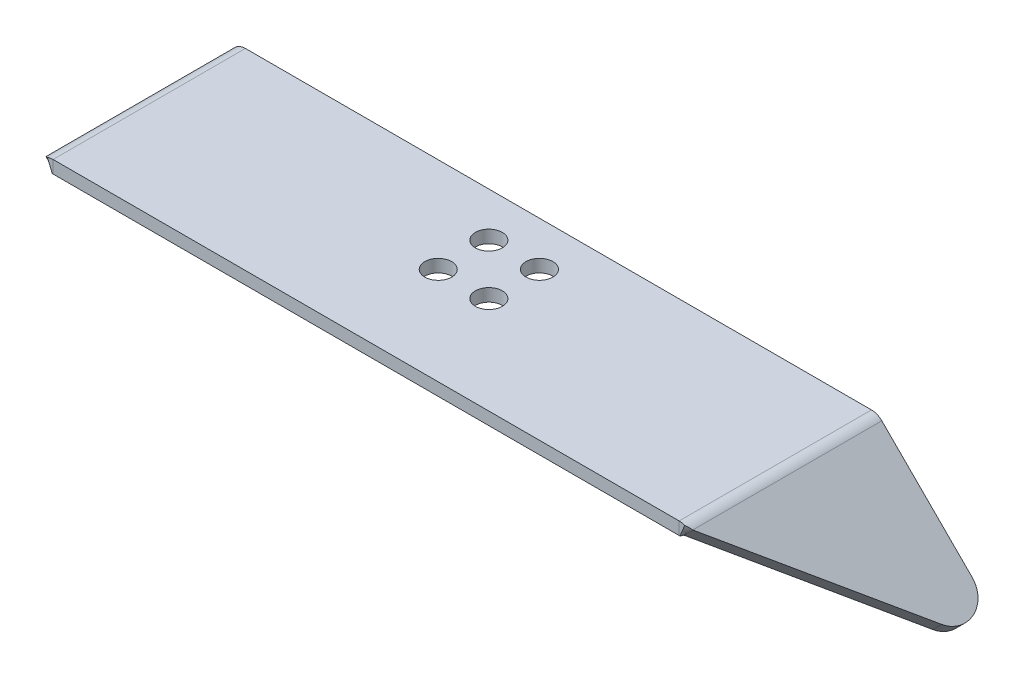
ISO-10303-21;
HEADER;
FILE_DESCRIPTION(('STEP AP214'),'2;1');
FILE_NAME('part.step','',(''),(''),'','','');
FILE_SCHEMA(('AUTOMOTIVE_DESIGN { 1 0 10303 214 1 1 1 1 }'));
ENDSEC;
DATA;
#1=APPLICATION_CONTEXT('core data for automotive mechanical design processes');
#2=APPLICATION_PROTOCOL_DEFINITION('international standard','automotive_design',2000,#1);
#3=PRODUCT_CONTEXT('',#1,'mechanical');
#4=PRODUCT('Part','Part','',(#3));
#5=PRODUCT_RELATED_PRODUCT_CATEGORY('part','',(#4));
#6=PRODUCT_DEFINITION_FORMATION('','',#4);
#7=PRODUCT_DEFINITION_CONTEXT('part definition',#1,'design');
#8=PRODUCT_DEFINITION('design','',#6,#7);
#9=PRODUCT_DEFINITION_SHAPE('','',#8);
#10=(LENGTH_UNIT() NAMED_UNIT(*) SI_UNIT(.MILLI.,.METRE.));
#11=(NAMED_UNIT(*) PLANE_ANGLE_UNIT() SI_UNIT($,.RADIAN.));
#12=(NAMED_UNIT(*) SI_UNIT($,.STERADIAN.) SOLID_ANGLE_UNIT());
#13=UNCERTAINTY_MEASURE_WITH_UNIT(LENGTH_MEASURE(1.E-05),#10,'distance_accuracy_value','');
#14=(GEOMETRIC_REPRESENTATION_CONTEXT(3) GLOBAL_UNCERTAINTY_ASSIGNED_CONTEXT((#13)) GLOBAL_UNIT_ASSIGNED_CONTEXT((#10,
#11,#12)) REPRESENTATION_CONTEXT('',''));
#15=CARTESIAN_POINT('',(0.,0.,0.));
#16=DIRECTION('',(0.,0.,1.));
#17=DIRECTION('',(1.,0.,0.));
#18=AXIS2_PLACEMENT_3D('',#15,#16,#17);
#19=CARTESIAN_POINT('',(-112.304743878931,3.175,6.35));
#20=DIRECTION('',(0.,-1.,0.));
#21=DIRECTION('',(0.,0.,-1.));
#22=AXIS2_PLACEMENT_3D('',#19,#20,#21);
#23=PLANE('',#22);
#24=CARTESIAN_POINT('',(-6.35,3.175,11.1125));
#25=DIRECTION('',(0.,1.,0.));
#26=DIRECTION('',(0.,0.,1.));
#27=AXIS2_PLACEMENT_3D('',#24,#25,#26);
#28=CIRCLE('',#27,3.3782);
#29=CARTESIAN_POINT('',(-6.35,3.175,14.4907));
#30=VERTEX_POINT('',#29);
#31=EDGE_CURVE('E593',#30,#30,#28,.T.);
#32=ORIENTED_EDGE('',*,*,#31,.F.);
#33=EDGE_LOOP('',(#32));
#34=FACE_BOUND('',#33,.T.);
#35=CARTESIAN_POINT('',(6.35,3.175,11.1125));
#36=DIRECTION('',(0.,1.,0.));
#37=DIRECTION('',(0.,0.,1.));
#38=AXIS2_PLACEMENT_3D('',#35,#36,#37);
#39=CIRCLE('',#38,3.3782);
#40=CARTESIAN_POINT('',(6.35,3.175,14.4907));
#41=VERTEX_POINT('',#40);
#42=EDGE_CURVE('E587',#41,#41,#39,.T.);
#43=ORIENTED_EDGE('',*,*,#42,.F.);
#44=EDGE_LOOP('',(#43));
#45=FACE_BOUND('',#44,.T.);
#46=CARTESIAN_POINT('',(-6.35,3.175,23.8125));
#47=DIRECTION('',(0.,1.,0.));
#48=DIRECTION('',(0.,0.,1.));
#49=AXIS2_PLACEMENT_3D('',#46,#47,#48);
#50=CIRCLE('',#49,3.3782);
#51=CARTESIAN_POINT('',(-6.35,3.175,27.1907));
#52=VERTEX_POINT('',#51);
#53=EDGE_CURVE('E571',#52,#52,#50,.T.);
#54=ORIENTED_EDGE('',*,*,#53,.F.);
#55=EDGE_LOOP('',(#54));
#56=FACE_BOUND('',#55,.T.);
#57=DIRECTION('',(0.,0.,1.));
#58=VECTOR('',#57,1.);
#59=CARTESIAN_POINT('',(78.5552406669539,3.175,6.35));
#60=LINE('',#59,#58);
#61=CARTESIAN_POINT('',(78.5552406669539,3.175,0.));
#62=VERTEX_POINT('',#61);
#63=CARTESIAN_POINT('',(78.5552406669539,3.175,48.26));
#64=VERTEX_POINT('',#63);
#65=EDGE_CURVE('E333',#62,#64,#60,.T.);
#66=ORIENTED_EDGE('',*,*,#65,.F.);
#67=DIRECTION('',(-1.,0.,0.));
#68=VECTOR('',#67,1.);
#69=CARTESIAN_POINT('',(112.304743878931,3.175,0.));
#70=LINE('',#69,#68);
#71=CARTESIAN_POINT('',(-78.5552406669539,3.175,0.));
#72=VERTEX_POINT('',#71);
#73=EDGE_CURVE('E350',#62,#72,#70,.T.);
#74=ORIENTED_EDGE('',*,*,#73,.T.);
#75=DIRECTION('',(0.,0.,1.));
#76=VECTOR('',#75,1.);
#77=CARTESIAN_POINT('',(-78.5552406669539,3.175,6.35));
#78=LINE('',#77,#76);
#79=CARTESIAN_POINT('',(-78.5552406669538,3.175,48.26));
#80=VERTEX_POINT('',#79);
#81=EDGE_CURVE('E354',#72,#80,#78,.T.);
#82=ORIENTED_EDGE('',*,*,#81,.T.);
#83=DIRECTION('',(1.,0.,0.));
#84=VECTOR('',#83,1.);
#85=CARTESIAN_POINT('',(79.375,3.175,48.26));
#86=LINE('',#85,#84);
#87=EDGE_CURVE('E348',#80,#64,#86,.T.);
#88=ORIENTED_EDGE('',*,*,#87,.T.);
#89=EDGE_LOOP('',(#66,#74,#82,#88));
#90=FACE_BOUND('',#89,.T.);
#91=CARTESIAN_POINT('',(6.35,3.175,23.8125));
#92=DIRECTION('',(0.,1.,0.));
#93=DIRECTION('',(0.,0.,1.));
#94=AXIS2_PLACEMENT_3D('',#91,#92,#93);
#95=CIRCLE('',#94,3.3782);
#96=CARTESIAN_POINT('',(6.35,3.175,27.1907));
#97=VERTEX_POINT('',#96);
#98=EDGE_CURVE('E579',#97,#97,#95,.T.);
#99=ORIENTED_EDGE('',*,*,#98,.F.);
#100=EDGE_LOOP('',(#99));
#101=FACE_BOUND('',#100,.T.);
#102=ADVANCED_FACE('F61',(#34,#45,#56,#90,#101),#23,.F.);
#103=CARTESIAN_POINT('',(-112.304743878931,0.,6.35));
#104=DIRECTION('',(0.,-1.,0.));
#105=DIRECTION('',(0.,0.,-1.));
#106=AXIS2_PLACEMENT_3D('',#103,#104,#105);
#107=PLANE('',#106);
#108=CARTESIAN_POINT('',(-6.35,0.,11.1125));
#109=DIRECTION('',(0.,-1.,0.));
#110=DIRECTION('',(0.,0.,-1.));
#111=AXIS2_PLACEMENT_3D('',#108,#109,#110);
#112=CIRCLE('',#111,3.3782);
#113=CARTESIAN_POINT('',(-6.35,0.,7.7343));
#114=VERTEX_POINT('',#113);
#115=EDGE_CURVE('E590',#114,#114,#112,.T.);
#116=ORIENTED_EDGE('',*,*,#115,.F.);
#117=EDGE_LOOP('',(#116));
#118=FACE_BOUND('',#117,.T.);
#119=CARTESIAN_POINT('',(6.35,0.,11.1125));
#120=DIRECTION('',(0.,-1.,0.));
#121=DIRECTION('',(0.,0.,-1.));
#122=AXIS2_PLACEMENT_3D('',#119,#120,#121);
#123=CIRCLE('',#122,3.3782);
#124=CARTESIAN_POINT('',(6.35,0.,7.7343));
#125=VERTEX_POINT('',#124);
#126=EDGE_CURVE('E584',#125,#125,#123,.T.);
#127=ORIENTED_EDGE('',*,*,#126,.F.);
#128=EDGE_LOOP('',(#127));
#129=FACE_BOUND('',#128,.T.);
#130=CARTESIAN_POINT('',(6.35,0.,23.8125));
#131=DIRECTION('',(0.,-1.,0.));
#132=DIRECTION('',(0.,0.,-1.));
#133=AXIS2_PLACEMENT_3D('',#130,#131,#132);
#134=CIRCLE('',#133,3.3782);
#135=CARTESIAN_POINT('',(6.35,0.,20.4343));
#136=VERTEX_POINT('',#135);
#137=EDGE_CURVE('E575',#136,#136,#134,.T.);
#138=ORIENTED_EDGE('',*,*,#137,.F.);
#139=EDGE_LOOP('',(#138));
#140=FACE_BOUND('',#139,.T.);
#141=CARTESIAN_POINT('',(-6.35,0.,23.8125));
#142=DIRECTION('',(0.,-1.,0.));
#143=DIRECTION('',(0.,0.,-1.));
#144=AXIS2_PLACEMENT_3D('',#141,#142,#143);
#145=CIRCLE('',#144,3.3782);
#146=CARTESIAN_POINT('',(-6.35,0.,20.4343));
#147=VERTEX_POINT('',#146);
#148=EDGE_CURVE('E199',#147,#147,#145,.T.);
#149=ORIENTED_EDGE('',*,*,#148,.F.);
#150=EDGE_LOOP('',(#149));
#151=FACE_BOUND('',#150,.T.);
#152=DIRECTION('',(-1.,0.,0.));
#153=VECTOR('',#152,1.);
#154=CARTESIAN_POINT('',(-112.304743878931,0.,0.));
#155=LINE('',#154,#153);
#156=CARTESIAN_POINT('',(78.5552406669539,0.,0.));
#157=VERTEX_POINT('',#156);
#158=CARTESIAN_POINT('',(-78.5552406669539,0.,0.));
#159=VERTEX_POINT('',#158);
#160=EDGE_CURVE('E78',#157,#159,#155,.T.);
#161=ORIENTED_EDGE('',*,*,#160,.F.);
#162=DIRECTION('',(0.,0.,1.));
#163=VECTOR('',#162,1.);
#164=CARTESIAN_POINT('',(78.5552406669539,0.,6.35));
#165=LINE('',#164,#163);
#166=CARTESIAN_POINT('',(78.5552406669539,0.,48.26));
#167=VERTEX_POINT('',#166);
#168=EDGE_CURVE('E70',#157,#167,#165,.T.);
#169=ORIENTED_EDGE('',*,*,#168,.T.);
#170=DIRECTION('',(1.,0.,0.));
#171=VECTOR('',#170,1.);
#172=CARTESIAN_POINT('',(79.375,0.,48.26));
#173=LINE('',#172,#171);
#174=CARTESIAN_POINT('',(-78.5552406669538,0.,48.26));
#175=VERTEX_POINT('',#174);
#176=EDGE_CURVE('E86',#175,#167,#173,.T.);
#177=ORIENTED_EDGE('',*,*,#176,.F.);
#178=DIRECTION('',(0.,0.,1.));
#179=VECTOR('',#178,1.);
#180=CARTESIAN_POINT('',(-78.5552406669539,0.,6.35));
#181=LINE('',#180,#179);
#182=EDGE_CURVE('E471',#159,#175,#181,.T.);
#183=ORIENTED_EDGE('',*,*,#182,.F.);
#184=EDGE_LOOP('',(#161,#169,#177,#183));
#185=FACE_BOUND('',#184,.T.);
#186=ADVANCED_FACE('F387',(#118,#129,#140,#151,#185),#107,.T.);
#187=CARTESIAN_POINT('',(-112.304743878931,3.175,0.));
#188=DIRECTION('',(0.,0.,1.));
#189=DIRECTION('',(1.,0.,0.));
#190=AXIS2_PLACEMENT_3D('',#187,#188,#189);
#191=PLANE('',#190);
#192=DIRECTION('',(0.,1.,0.));
#193=VECTOR('',#192,1.);
#194=CARTESIAN_POINT('',(78.5552406669539,3.175,0.));
#195=LINE('',#194,#193);
#196=EDGE_CURVE('E12',#157,#62,#195,.T.);
#197=ORIENTED_EDGE('',*,*,#196,.F.);
#198=ORIENTED_EDGE('',*,*,#160,.T.);
#199=DIRECTION('',(0.,1.,0.));
#200=VECTOR('',#199,1.);
#201=CARTESIAN_POINT('',(-78.5552406669539,3.175,0.));
#202=LINE('',#201,#200);
#203=EDGE_CURVE('E468',#159,#72,#202,.T.);
#204=ORIENTED_EDGE('',*,*,#203,.T.);
#205=ORIENTED_EDGE('',*,*,#73,.F.);
#206=EDGE_LOOP('',(#197,#198,#204,#205));
#207=FACE_BOUND('',#206,.T.);
#208=ADVANCED_FACE('F63',(#207),#191,.F.);
#209=CARTESIAN_POINT('',(79.375,3.175,48.26));
#210=DIRECTION('',(0.,0.,-1.));
#211=DIRECTION('',(-1.,0.,0.));
#212=AXIS2_PLACEMENT_3D('',#209,#210,#211);
#213=PLANE('',#212);
#214=DIRECTION('',(0.,-1.,0.));
#215=VECTOR('',#214,1.);
#216=CARTESIAN_POINT('',(78.5552406669539,3.175,48.26));
#217=LINE('',#216,#215);
#218=EDGE_CURVE('E341',#64,#167,#217,.T.);
#219=ORIENTED_EDGE('',*,*,#218,.F.);
#220=ORIENTED_EDGE('',*,*,#87,.F.);
#221=DIRECTION('',(0.,-1.,0.));
#222=VECTOR('',#221,1.);
#223=CARTESIAN_POINT('',(-78.5552406669539,3.175,48.26));
#224=LINE('',#223,#222);
#225=EDGE_CURVE('E342',#80,#175,#224,.T.);
#226=ORIENTED_EDGE('',*,*,#225,.T.);
#227=ORIENTED_EDGE('',*,*,#176,.T.);
#228=EDGE_LOOP('',(#219,#220,#226,#227));
#229=FACE_BOUND('',#228,.T.);
#230=ADVANCED_FACE('F397',(#229),#213,.F.);
#231=CARTESIAN_POINT('',(-78.5552406669539,-0.5,0.));
#232=DIRECTION('',(0.,0.,-1.));
#233=DIRECTION('',(-1.,0.,0.));
#234=AXIS2_PLACEMENT_3D('',#231,#232,#233);
#235=PLANE('',#234);
#236=ORIENTED_EDGE('',*,*,#203,.F.);
#237=CARTESIAN_POINT('',(-78.5552406669539,-0.5,0.));
#238=DIRECTION('',(0.,0.,1.));
#239=DIRECTION('',(1.,0.,0.));
#240=AXIS2_PLACEMENT_3D('',#237,#238,#239);
#241=CIRCLE('',#240,0.5);
#242=CARTESIAN_POINT('',(-78.9087940575472,-0.146446609406728,0.));
#243=VERTEX_POINT('',#242);
#244=EDGE_CURVE('E488',#159,#243,#241,.T.);
#245=ORIENTED_EDGE('',*,*,#244,.T.);
#246=DIRECTION('',(-0.707106781186549,0.707106781186546,0.));
#247=VECTOR('',#246,1.);
#248=CARTESIAN_POINT('',(-81.1538580878145,2.09861742086056,0.));
#249=LINE('',#248,#247);
#250=CARTESIAN_POINT('',(-81.1538580878145,2.09861742086057,0.));
#251=VERTEX_POINT('',#250);
#252=EDGE_CURVE('E512',#243,#251,#249,.T.);
#253=ORIENTED_EDGE('',*,*,#252,.T.);
#254=CARTESIAN_POINT('',(-78.5552406669539,-0.5,0.));
#255=DIRECTION('',(0.,0.,1.));
#256=DIRECTION('',(1.,0.,0.));
#257=AXIS2_PLACEMENT_3D('',#254,#255,#256);
#258=CIRCLE('',#257,3.675);
#259=EDGE_CURVE('E515',#72,#251,#258,.T.);
#260=ORIENTED_EDGE('',*,*,#259,.F.);
#261=EDGE_LOOP('',(#236,#245,#253,#260));
#262=FACE_BOUND('',#261,.T.);
#263=ADVANCED_FACE('F400',(#262),#235,.T.);
#264=CARTESIAN_POINT('',(-81.1538580878145,2.0986174208605,47.4402406669539));
#265=CARTESIAN_POINT('',(-80.813541159747,2.43893434892808,47.7136212660518));
#266=CARTESIAN_POINT('',(-80.4062477754293,2.71107908769504,47.9866194009021));
#267=CARTESIAN_POINT('',(-79.9616022808957,2.89525728197895,48.26));
#268=CARTESIAN_POINT('',(-78.9087940575472,-0.146446609406734,47.4402406669539));
#269=CARTESIAN_POINT('',(-78.862512230733,-0.10016478259256,47.7135043833971));
#270=CARTESIAN_POINT('',(-78.8070525039987,-0.0631077779238326,47.9867362835569));
#271=CARTESIAN_POINT('',(-78.7465823831365,-0.0380602337443602,48.26));
#272=B_SPLINE_SURFACE_WITH_KNOTS('',1,3,((#264,#265,#266,#267),(#268,#269,#270,#271)),
.UNSPECIFIED.,.F.,.F.,.F.,(2,2),(4,4),(0.,1.),(0.,1.),.UNSPECIFIED.);
#273=CARTESIAN_POINT('',(-81.1538580878145,2.0986174208605,47.4402406669539));
#274=CARTESIAN_POINT('',(-78.9087940575472,-0.146446609406734,47.4402406669539));
#275=B_SPLINE_CURVE_WITH_KNOTS('',1,(#273,#274),.UNSPECIFIED.,.F.,.F.,(2,2),(0.,1.),.UNSPECIFIED.);
#276=CARTESIAN_POINT('',(-81.1538580878145,2.0986174208605,47.4402406669539));
#277=VERTEX_POINT('',#276);
#278=CARTESIAN_POINT('',(-78.9087940575472,-0.146446609406728,47.4402406669539));
#279=VERTEX_POINT('',#278);
#280=EDGE_CURVE('E456',#277,#279,#275,.T.);
#281=CARTESIAN_POINT('',(-78.9087940575472,-0.146446609406734,47.4402406669539));
#282=CARTESIAN_POINT('',(-78.862512230733,-0.10016478259256,47.7135043833971));
#283=CARTESIAN_POINT('',(-78.8070525039987,-0.0631077779238326,47.9867362835569));
#284=CARTESIAN_POINT('',(-78.7465823831365,-0.0380602337443602,48.26));
#285=B_SPLINE_CURVE_WITH_KNOTS('',3,(#281,#282,#283,#284),.UNSPECIFIED.,.F.,.F.,(4,4),(0.,1.),.UNSPECIFIED.);
#286=CARTESIAN_POINT('',(-78.7465823831365,-0.0380602337443602,48.26));
#287=VERTEX_POINT('',#286);
#288=EDGE_CURVE('E522',#279,#287,#285,.T.);
#289=CARTESIAN_POINT('',(-78.7465823831365,-0.0380602337443602,48.26));
#290=CARTESIAN_POINT('',(-79.9616022808957,2.89525728197895,48.26));
#291=B_SPLINE_CURVE_WITH_KNOTS('',1,(#289,#290),.UNSPECIFIED.,.F.,.F.,(2,2),(0.,1.),.UNSPECIFIED.);
#292=CARTESIAN_POINT('',(-79.9616022808957,2.89525728197895,48.26));
#293=VERTEX_POINT('',#292);
#294=EDGE_CURVE('E347',#287,#293,#291,.T.);
#295=CARTESIAN_POINT('',(-79.9616022808957,2.89525728197895,48.26));
#296=CARTESIAN_POINT('',(-80.4062477754293,2.71107908769504,47.9866194009021));
#297=CARTESIAN_POINT('',(-80.813541159747,2.43893434892808,47.7136212660518));
#298=CARTESIAN_POINT('',(-81.1538580878145,2.0986174208605,47.4402406669539));
#299=B_SPLINE_CURVE_WITH_KNOTS('',3,(#295,#296,#297,#298),.UNSPECIFIED.,.F.,.F.,(4,4),(0.,1.),.UNSPECIFIED.);
#300=EDGE_CURVE('E518',#277,#293,#299,.F.);
#301=ORIENTED_EDGE('',*,*,#280,.T.);
#302=ORIENTED_EDGE('',*,*,#288,.T.);
#303=ORIENTED_EDGE('',*,*,#294,.T.);
#304=ORIENTED_EDGE('',*,*,#300,.F.);
#305=EDGE_LOOP('',(#301,#302,#303,#304));
#306=FACE_BOUND('',#305,.T.);
#307=ADVANCED_FACE('F403',(#306),#272,.T.);
#308=CARTESIAN_POINT('',(-78.5552406669539,-0.5,48.26));
#309=DIRECTION('',(0.,0.,1.));
#310=DIRECTION('',(1.,0.,0.));
#311=AXIS2_PLACEMENT_3D('',#308,#309,#310);
#312=PLANE('',#311);
#313=ORIENTED_EDGE('',*,*,#294,.F.);
#314=CARTESIAN_POINT('',(-78.5552406669539,-0.5,48.26));
#315=DIRECTION('',(0.,0.,1.));
#316=DIRECTION('',(1.,0.,0.));
#317=AXIS2_PLACEMENT_3D('',#314,#315,#316);
#318=CIRCLE('',#317,0.5);
#319=EDGE_CURVE('E519',#287,#175,#318,.F.);
#320=ORIENTED_EDGE('',*,*,#319,.T.);
#321=ORIENTED_EDGE('',*,*,#225,.F.);
#322=CARTESIAN_POINT('',(-78.5552406669539,-0.5,48.26));
#323=DIRECTION('',(0.,0.,-1.));
#324=DIRECTION('',(-1.,0.,0.));
#325=AXIS2_PLACEMENT_3D('',#322,#323,#324);
#326=CIRCLE('',#325,3.675);
#327=EDGE_CURVE('E529',#293,#80,#326,.T.);
#328=ORIENTED_EDGE('',*,*,#327,.F.);
#329=EDGE_LOOP('',(#313,#320,#321,#328));
#330=FACE_BOUND('',#329,.T.);
#331=ADVANCED_FACE('F410',(#330),#312,.T.);
#332=CARTESIAN_POINT('',(-78.5552406669539,-0.5,-24.2621093408467));
#333=DIRECTION('',(0.,0.,1.));
#334=DIRECTION('',(1.,0.,0.));
#335=AXIS2_PLACEMENT_3D('',#332,#333,#334);
#336=CYLINDRICAL_SURFACE('',#335,3.675);
#337=ORIENTED_EDGE('',*,*,#327,.T.);
#338=ORIENTED_EDGE('',*,*,#81,.F.);
#339=ORIENTED_EDGE('',*,*,#259,.T.);
#340=DIRECTION('',(0.,0.,1.));
#341=VECTOR('',#340,1.);
#342=CARTESIAN_POINT('',(-81.1538580878145,2.09861742086056,6.35));
#343=LINE('',#342,#341);
#344=EDGE_CURVE('E481',#251,#277,#343,.T.);
#345=ORIENTED_EDGE('',*,*,#344,.T.);
#346=ORIENTED_EDGE('',*,*,#300,.T.);
#347=EDGE_LOOP('',(#337,#338,#339,#345,#346));
#348=FACE_BOUND('',#347,.T.);
#349=ADVANCED_FACE('F324',(#348),#336,.T.);
#350=CARTESIAN_POINT('',(-78.5552406669539,-0.5,-24.2621093408467));
#351=DIRECTION('',(0.,0.,1.));
#352=DIRECTION('',(1.,0.,0.));
#353=AXIS2_PLACEMENT_3D('',#350,#351,#352);
#354=CYLINDRICAL_SURFACE('',#353,0.5);
#355=ORIENTED_EDGE('',*,*,#319,.F.);
#356=ORIENTED_EDGE('',*,*,#288,.F.);
#357=DIRECTION('',(0.,0.,1.));
#358=VECTOR('',#357,1.);
#359=CARTESIAN_POINT('',(-78.9087940575472,-0.146446609406728,6.35));
#360=LINE('',#359,#358);
#361=EDGE_CURVE('E492',#243,#279,#360,.T.);
#362=ORIENTED_EDGE('',*,*,#361,.F.);
#363=ORIENTED_EDGE('',*,*,#244,.F.);
#364=ORIENTED_EDGE('',*,*,#182,.T.);
#365=EDGE_LOOP('',(#355,#356,#362,#363,#364));
#366=FACE_BOUND('',#365,.T.);
#367=ADVANCED_FACE('F307',(#366),#354,.F.);
#368=CARTESIAN_POINT('',(-103.859045904005,-20.6065703953298,6.35));
#369=DIRECTION('',(0.707106781186549,-0.707106781186546,0.));
#370=DIRECTION('',(0.,0.,-1.));
#371=AXIS2_PLACEMENT_3D('',#368,#369,#370);
#372=CYLINDRICAL_SURFACE('',#371,6.35);
#373=CARTESIAN_POINT('',(-101.613981873737,-22.851634425597,6.35));
#374=DIRECTION('',(-0.707106781186549,0.707106781186546,0.));
#375=DIRECTION('',(0.,0.,-1.));
#376=AXIS2_PLACEMENT_3D('',#373,#374,#375);
#377=CIRCLE('',#376,6.35);
#378=CARTESIAN_POINT('',(-101.613981873737,-22.8516344255969,0.));
#379=VERTEX_POINT('',#378);
#380=CARTESIAN_POINT('',(-104.788981873737,-26.026634425597,10.8401280605347));
#381=VERTEX_POINT('',#380);
#382=EDGE_CURVE('E510',#379,#381,#377,.T.);
#383=ORIENTED_EDGE('',*,*,#382,.T.);
#384=DIRECTION('',(0.707106781186549,-0.707106781186546,0.));
#385=VECTOR('',#384,1.);
#386=CARTESIAN_POINT('',(-107.034045904005,-23.7815703953297,10.8401280605347));
#387=LINE('',#386,#385);
#388=CARTESIAN_POINT('',(-107.034045904005,-23.7815703953297,10.8401280605347));
#389=VERTEX_POINT('',#388);
#390=EDGE_CURVE('E489',#389,#381,#387,.T.);
#391=ORIENTED_EDGE('',*,*,#390,.F.);
#392=CARTESIAN_POINT('',(-103.859045904005,-20.6065703953298,6.35));
#393=DIRECTION('',(-0.707106781186549,0.707106781186546,0.));
#394=DIRECTION('',(0.,0.,-1.));
#395=AXIS2_PLACEMENT_3D('',#392,#393,#394);
#396=CIRCLE('',#395,6.35);
#397=CARTESIAN_POINT('',(-103.859045904005,-20.6065703953297,0.));
#398=VERTEX_POINT('',#397);
#399=EDGE_CURVE('E478',#398,#389,#396,.T.);
#400=ORIENTED_EDGE('',*,*,#399,.F.);
#401=DIRECTION('',(0.707106781186549,-0.707106781186546,0.));
#402=VECTOR('',#401,1.);
#403=CARTESIAN_POINT('',(-103.859045904005,-20.6065703953297,0.));
#404=LINE('',#403,#402);
#405=EDGE_CURVE('E508',#398,#379,#404,.T.);
#406=ORIENTED_EDGE('',*,*,#405,.T.);
#407=EDGE_LOOP('',(#383,#391,#400,#406));
#408=FACE_BOUND('',#407,.T.);
#409=ADVANCED_FACE('F303',(#408),#372,.T.);
#410=CARTESIAN_POINT('',(-103.859045904005,-20.6065703953298,6.35));
#411=DIRECTION('',(0.707106781186549,-0.707106781186546,0.));
#412=DIRECTION('',(0.,0.,-1.));
#413=AXIS2_PLACEMENT_3D('',#410,#411,#412);
#414=PLANE('',#413);
#415=ORIENTED_EDGE('',*,*,#344,.F.);
#416=DIRECTION('',(-0.707106781186546,-0.707106781186549,0.));
#417=VECTOR('',#416,1.);
#418=CARTESIAN_POINT('',(54.9638460084156,138.216321517091,0.));
#419=LINE('',#418,#417);
#420=EDGE_CURVE('E506',#251,#398,#419,.T.);
#421=ORIENTED_EDGE('',*,*,#420,.T.);
#422=ORIENTED_EDGE('',*,*,#399,.T.);
#423=DIRECTION('',(0.499999999999998,0.5,0.707106781186549));
#424=VECTOR('',#423,1.);
#425=CARTESIAN_POINT('',(-80.5742007044766,2.67827480419841,48.26));
#426=LINE('',#425,#424);
#427=EDGE_CURVE('E474',#389,#277,#426,.T.);
#428=ORIENTED_EDGE('',*,*,#427,.T.);
#429=EDGE_LOOP('',(#415,#421,#422,#428));
#430=FACE_BOUND('',#429,.T.);
#431=ADVANCED_FACE('F306',(#430),#414,.F.);
#432=CARTESIAN_POINT('',(-103.859045904005,-20.6065703953297,0.));
#433=DIRECTION('',(0.,0.,1.));
#434=DIRECTION('',(0.707106781186546,0.707106781186549,0.));
#435=AXIS2_PLACEMENT_3D('',#432,#433,#434);
#436=PLANE('',#435);
#437=ORIENTED_EDGE('',*,*,#252,.F.);
#438=DIRECTION('',(-0.707106781186546,-0.707106781186549,0.));
#439=VECTOR('',#438,1.);
#440=CARTESIAN_POINT('',(-101.613981873737,-22.8516344255969,0.));
#441=LINE('',#440,#439);
#442=EDGE_CURVE('E477',#243,#379,#441,.T.);
#443=ORIENTED_EDGE('',*,*,#442,.T.);
#444=ORIENTED_EDGE('',*,*,#405,.F.);
#445=ORIENTED_EDGE('',*,*,#420,.F.);
#446=EDGE_LOOP('',(#437,#443,#444,#445));
#447=FACE_BOUND('',#446,.T.);
#448=ADVANCED_FACE('F311',(#447),#436,.F.);
#449=CARTESIAN_POINT('',(-101.613981873737,-22.851634425597,6.35));
#450=DIRECTION('',(0.707106781186549,-0.707106781186546,0.));
#451=DIRECTION('',(0.,0.,-1.));
#452=AXIS2_PLACEMENT_3D('',#449,#450,#451);
#453=PLANE('',#452);
#454=ORIENTED_EDGE('',*,*,#442,.F.);
#455=ORIENTED_EDGE('',*,*,#361,.T.);
#456=DIRECTION('',(0.499999999999998,0.5,0.707106781186549));
#457=VECTOR('',#456,1.);
#458=CARTESIAN_POINT('',(-78.3291366742094,0.433210773931124,48.26));
#459=LINE('',#458,#457);
#460=EDGE_CURVE('E486',#381,#279,#459,.T.);
#461=ORIENTED_EDGE('',*,*,#460,.F.);
#462=ORIENTED_EDGE('',*,*,#382,.F.);
#463=EDGE_LOOP('',(#454,#455,#461,#462));
#464=FACE_BOUND('',#463,.T.);
#465=ADVANCED_FACE('F315',(#464),#453,.T.);
#466=CARTESIAN_POINT('',(-80.5742007044766,2.67827480419841,48.26));
#467=DIRECTION('',(0.5,0.500000000000002,-0.707106781186546));
#468=DIRECTION('',(-0.499999999999998,-0.5,-0.707106781186549));
#469=AXIS2_PLACEMENT_3D('',#466,#467,#468);
#470=PLANE('',#469);
#471=ORIENTED_EDGE('',*,*,#280,.F.);
#472=ORIENTED_EDGE('',*,*,#427,.F.);
#473=ORIENTED_EDGE('',*,*,#390,.T.);
#474=ORIENTED_EDGE('',*,*,#460,.T.);
#475=EDGE_LOOP('',(#471,#472,#473,#474));
#476=FACE_BOUND('',#475,.T.);
#477=ADVANCED_FACE('F301',(#476),#470,.F.);
#478=CARTESIAN_POINT('',(78.5552406669539,-0.5,0.));
#479=DIRECTION('',(0.,0.,-1.));
#480=DIRECTION('',(0.,1.,0.));
#481=AXIS2_PLACEMENT_3D('',#478,#479,#480);
#482=PLANE('',#481);
#483=DIRECTION('',(0.707106781186549,0.707106781186546,0.));
#484=VECTOR('',#483,1.);
#485=CARTESIAN_POINT('',(81.1538580878145,2.09861742086056,0.));
#486=LINE('',#485,#484);
#487=CARTESIAN_POINT('',(78.9087940575472,-0.146446609406728,0.));
#488=VERTEX_POINT('',#487);
#489=CARTESIAN_POINT('',(81.1538580878145,2.09861742086056,0.));
#490=VERTEX_POINT('',#489);
#491=EDGE_CURVE('E177',#488,#490,#486,.T.);
#492=ORIENTED_EDGE('',*,*,#491,.F.);
#493=CARTESIAN_POINT('',(78.5552406669539,-0.5,0.));
#494=DIRECTION('',(0.,0.,-1.));
#495=DIRECTION('',(-1.,0.,0.));
#496=AXIS2_PLACEMENT_3D('',#493,#494,#495);
#497=CIRCLE('',#496,0.5);
#498=EDGE_CURVE('E192',#488,#157,#497,.F.);
#499=ORIENTED_EDGE('',*,*,#498,.T.);
#500=ORIENTED_EDGE('',*,*,#196,.T.);
#501=CARTESIAN_POINT('',(78.5552406669539,-0.5,0.));
#502=DIRECTION('',(0.,0.,1.));
#503=DIRECTION('',(0.,-1.,0.));
#504=AXIS2_PLACEMENT_3D('',#501,#502,#503);
#505=CIRCLE('',#504,3.675);
#506=EDGE_CURVE('E209',#490,#62,#505,.T.);
#507=ORIENTED_EDGE('',*,*,#506,.F.);
#508=EDGE_LOOP('',(#492,#499,#500,#507));
#509=FACE_BOUND('',#508,.T.);
#510=ADVANCED_FACE('F298',(#509),#482,.T.);
#511=CARTESIAN_POINT('',(78.5552406669539,-0.5,48.26));
#512=DIRECTION('',(0.,0.,1.));
#513=DIRECTION('',(1.,0.,0.));
#514=AXIS2_PLACEMENT_3D('',#511,#512,#513);
#515=PLANE('',#514);
#516=ORIENTED_EDGE('',*,*,#218,.T.);
#517=CARTESIAN_POINT('',(78.5552406669539,-0.5,48.26));
#518=DIRECTION('',(0.,0.,-1.));
#519=DIRECTION('',(-1.,0.,0.));
#520=AXIS2_PLACEMENT_3D('',#517,#518,#519);
#521=CIRCLE('',#520,0.5);
#522=CARTESIAN_POINT('',(78.7465823831364,-0.0380602337443579,48.26));
#523=VERTEX_POINT('',#522);
#524=EDGE_CURVE('E195',#167,#523,#521,.T.);
#525=ORIENTED_EDGE('',*,*,#524,.T.);
#526=CARTESIAN_POINT('',(79.9616022808956,2.89525728197896,48.26));
#527=CARTESIAN_POINT('',(78.7465823831365,-0.0380602337443589,48.26));
#528=B_SPLINE_CURVE_WITH_KNOTS('',1,(#526,#527),.UNSPECIFIED.,.F.,.F.,(2,2),(0.,1.),.UNSPECIFIED.);
#529=CARTESIAN_POINT('',(79.9616022808956,2.89525728197897,48.26));
#530=VERTEX_POINT('',#529);
#531=EDGE_CURVE('E283',#523,#530,#528,.F.);
#532=ORIENTED_EDGE('',*,*,#531,.T.);
#533=CARTESIAN_POINT('',(78.5552406669539,-0.5,48.26));
#534=DIRECTION('',(0.,0.,-1.));
#535=DIRECTION('',(-1.,0.,0.));
#536=AXIS2_PLACEMENT_3D('',#533,#534,#535);
#537=CIRCLE('',#536,3.675);
#538=EDGE_CURVE('E212',#64,#530,#537,.T.);
#539=ORIENTED_EDGE('',*,*,#538,.F.);
#540=EDGE_LOOP('',(#516,#525,#532,#539));
#541=FACE_BOUND('',#540,.T.);
#542=ADVANCED_FACE('F289',(#541),#515,.T.);
#543=CARTESIAN_POINT('',(79.9616022808956,2.89525728197896,48.26));
#544=CARTESIAN_POINT('',(80.4062477754292,2.71107908769509,47.9866194009022));
#545=CARTESIAN_POINT('',(80.813541159747,2.43893434892806,47.7136212660518));
#546=CARTESIAN_POINT('',(81.1538580878145,2.09861742086053,47.4402406669539));
#547=CARTESIAN_POINT('',(78.7465823831365,-0.0380602337443589,48.26));
#548=CARTESIAN_POINT('',(78.8070525039987,-0.063107777923823,47.986736283557));
#549=CARTESIAN_POINT('',(78.862512230733,-0.100164782592572,47.713504383397));
#550=CARTESIAN_POINT('',(78.9087940575472,-0.14644660940673,47.4402406669539));
#551=B_SPLINE_SURFACE_WITH_KNOTS('',1,3,((#543,#544,#545,#546),(#547,#548,#549,#550)),
.UNSPECIFIED.,.F.,.F.,.F.,(2,2),(4,4),(0.,1.),(0.,1.),.UNSPECIFIED.);
#552=CARTESIAN_POINT('',(78.7465823831365,-0.0380602337443589,48.26));
#553=CARTESIAN_POINT('',(78.8070525039987,-0.063107777923823,47.986736283557));
#554=CARTESIAN_POINT('',(78.862512230733,-0.100164782592572,47.713504383397));
#555=CARTESIAN_POINT('',(78.9087940575472,-0.14644660940673,47.4402406669539));
#556=B_SPLINE_CURVE_WITH_KNOTS('',3,(#552,#553,#554,#555),.UNSPECIFIED.,.F.,.F.,(4,4),(0.,1.),.UNSPECIFIED.);
#557=CARTESIAN_POINT('',(78.9087940575472,-0.146446609406735,47.4402406669539));
#558=VERTEX_POINT('',#557);
#559=EDGE_CURVE('E213',#523,#558,#556,.T.);
#560=CARTESIAN_POINT('',(78.9087940575472,-0.14644660940673,47.4402406669539));
#561=CARTESIAN_POINT('',(81.1538580878145,2.09861742086053,47.4402406669539));
#562=B_SPLINE_CURVE_WITH_KNOTS('',1,(#560,#561),.UNSPECIFIED.,.F.,.F.,(2,2),(0.,1.),.UNSPECIFIED.);
#563=CARTESIAN_POINT('',(81.1538580878145,2.09861742086053,47.4402406669539));
#564=VERTEX_POINT('',#563);
#565=EDGE_CURVE('E204',#564,#558,#562,.F.);
#566=CARTESIAN_POINT('',(81.1538580878145,2.09861742086053,47.4402406669539));
#567=CARTESIAN_POINT('',(80.813541159747,2.43893434892806,47.7136212660518));
#568=CARTESIAN_POINT('',(80.4062477754292,2.71107908769509,47.9866194009022));
#569=CARTESIAN_POINT('',(79.9616022808956,2.89525728197896,48.26));
#570=B_SPLINE_CURVE_WITH_KNOTS('',3,(#566,#567,#568,#569),.UNSPECIFIED.,.F.,.F.,(4,4),(0.,1.),.UNSPECIFIED.);
#571=EDGE_CURVE('E261',#530,#564,#570,.F.);
#572=ORIENTED_EDGE('',*,*,#531,.F.);
#573=ORIENTED_EDGE('',*,*,#559,.T.);
#574=ORIENTED_EDGE('',*,*,#565,.F.);
#575=ORIENTED_EDGE('',*,*,#571,.F.);
#576=EDGE_LOOP('',(#572,#573,#574,#575));
#577=FACE_BOUND('',#576,.T.);
#578=ADVANCED_FACE('F229',(#577),#551,.T.);
#579=CARTESIAN_POINT('',(78.5552406669539,-0.5,72.5221093408468));
#580=DIRECTION('',(0.,0.,-1.));
#581=DIRECTION('',(-1.,0.,0.));
#582=AXIS2_PLACEMENT_3D('',#579,#580,#581);
#583=CYLINDRICAL_SURFACE('',#582,3.675);
#584=ORIENTED_EDGE('',*,*,#571,.T.);
#585=DIRECTION('',(0.,0.,1.));
#586=VECTOR('',#585,1.);
#587=CARTESIAN_POINT('',(81.1538580878145,2.09861742086055,6.35));
#588=LINE('',#587,#586);
#589=EDGE_CURVE('E207',#490,#564,#588,.T.);
#590=ORIENTED_EDGE('',*,*,#589,.F.);
#591=ORIENTED_EDGE('',*,*,#506,.T.);
#592=ORIENTED_EDGE('',*,*,#65,.T.);
#593=ORIENTED_EDGE('',*,*,#538,.T.);
#594=EDGE_LOOP('',(#584,#590,#591,#592,#593));
#595=FACE_BOUND('',#594,.T.);
#596=ADVANCED_FACE('F218',(#595),#583,.T.);
#597=CARTESIAN_POINT('',(78.5552406669539,-0.5,72.5221093408468));
#598=DIRECTION('',(0.,0.,-1.));
#599=DIRECTION('',(-1.,0.,0.));
#600=AXIS2_PLACEMENT_3D('',#597,#598,#599);
#601=CYLINDRICAL_SURFACE('',#600,0.5);
#602=ORIENTED_EDGE('',*,*,#559,.F.);
#603=ORIENTED_EDGE('',*,*,#524,.F.);
#604=ORIENTED_EDGE('',*,*,#168,.F.);
#605=ORIENTED_EDGE('',*,*,#498,.F.);
#606=DIRECTION('',(0.,0.,1.));
#607=VECTOR('',#606,1.);
#608=CARTESIAN_POINT('',(78.9087940575472,-0.146446609406735,6.35));
#609=LINE('',#608,#607);
#610=EDGE_CURVE('E172',#488,#558,#609,.T.);
#611=ORIENTED_EDGE('',*,*,#610,.T.);
#612=EDGE_LOOP('',(#602,#603,#604,#605,#611));
#613=FACE_BOUND('',#612,.T.);
#614=ADVANCED_FACE('F228',(#613),#601,.F.);
#615=CARTESIAN_POINT('',(103.859045904005,-20.6065703953298,6.34999999999997));
#616=DIRECTION('',(-0.707106781186549,-0.707106781186546,0.));
#617=DIRECTION('',(0.,0.,-1.));
#618=AXIS2_PLACEMENT_3D('',#615,#616,#617);
#619=CYLINDRICAL_SURFACE('',#618,6.35);
#620=CARTESIAN_POINT('',(101.613981873737,-22.8516344255971,6.34999999999997));
#621=DIRECTION('',(0.707106781186549,0.707106781186546,0.));
#622=DIRECTION('',(0.,0.,1.));
#623=AXIS2_PLACEMENT_3D('',#620,#621,#622);
#624=CIRCLE('',#623,6.35);
#625=CARTESIAN_POINT('',(104.788981873737,-26.026634425597,10.8401280605346));
#626=VERTEX_POINT('',#625);
#627=CARTESIAN_POINT('',(101.613981873737,-22.851634425597,0.));
#628=VERTEX_POINT('',#627);
#629=EDGE_CURVE('E170',#626,#628,#624,.T.);
#630=ORIENTED_EDGE('',*,*,#629,.T.);
#631=DIRECTION('',(-0.707106781186549,-0.707106781186546,0.));
#632=VECTOR('',#631,1.);
#633=CARTESIAN_POINT('',(103.859045904005,-20.6065703953297,0.));
#634=LINE('',#633,#632);
#635=CARTESIAN_POINT('',(103.859045904005,-20.6065703953297,0.));
#636=VERTEX_POINT('',#635);
#637=EDGE_CURVE('E185',#636,#628,#634,.T.);
#638=ORIENTED_EDGE('',*,*,#637,.F.);
#639=CARTESIAN_POINT('',(103.859045904005,-20.6065703953298,6.34999999999997));
#640=DIRECTION('',(0.707106781186549,0.707106781186546,0.));
#641=DIRECTION('',(0.,0.,1.));
#642=AXIS2_PLACEMENT_3D('',#639,#640,#641);
#643=CIRCLE('',#642,6.35);
#644=CARTESIAN_POINT('',(107.034045904005,-23.7815703953297,10.8401280605346));
#645=VERTEX_POINT('',#644);
#646=EDGE_CURVE('E202',#645,#636,#643,.T.);
#647=ORIENTED_EDGE('',*,*,#646,.F.);
#648=DIRECTION('',(-0.707106781186549,-0.707106781186546,0.));
#649=VECTOR('',#648,1.);
#650=CARTESIAN_POINT('',(107.034045904005,-23.7815703953297,10.8401280605346));
#651=LINE('',#650,#649);
#652=EDGE_CURVE('E188',#645,#626,#651,.T.);
#653=ORIENTED_EDGE('',*,*,#652,.T.);
#654=EDGE_LOOP('',(#630,#638,#647,#653));
#655=FACE_BOUND('',#654,.T.);
#656=ADVANCED_FACE('F183',(#655),#619,.T.);
#657=CARTESIAN_POINT('',(-54.9638460084157,138.216321517091,6.35));
#658=DIRECTION('',(-0.707106781186549,-0.707106781186546,0.));
#659=DIRECTION('',(0.,0.,-1.));
#660=AXIS2_PLACEMENT_3D('',#657,#658,#659);
#661=PLANE('',#660);
#662=DIRECTION('',(-0.707106781186546,0.707106781186549,0.));
#663=VECTOR('',#662,1.);
#664=CARTESIAN_POINT('',(103.859045904005,-20.6065703953297,0.));
#665=LINE('',#664,#663);
#666=EDGE_CURVE('E191',#636,#490,#665,.T.);
#667=ORIENTED_EDGE('',*,*,#666,.T.);
#668=ORIENTED_EDGE('',*,*,#589,.T.);
#669=DIRECTION('',(0.499999999999998,-0.5,-0.707106781186549));
#670=VECTOR('',#669,1.);
#671=CARTESIAN_POINT('',(80.5742007044766,2.6782748041984,48.26));
#672=LINE('',#671,#670);
#673=EDGE_CURVE('E205',#564,#645,#672,.T.);
#674=ORIENTED_EDGE('',*,*,#673,.T.);
#675=ORIENTED_EDGE('',*,*,#646,.T.);
#676=EDGE_LOOP('',(#667,#668,#674,#675));
#677=FACE_BOUND('',#676,.T.);
#678=ADVANCED_FACE('F379',(#677),#661,.F.);
#679=CARTESIAN_POINT('',(80.5742007044766,2.6782748041984,48.26));
#680=DIRECTION('',(-0.5,0.500000000000002,-0.707106781186546));
#681=DIRECTION('',(-0.499999999999998,0.5,0.707106781186549));
#682=AXIS2_PLACEMENT_3D('',#679,#680,#681);
#683=PLANE('',#682);
#684=ORIENTED_EDGE('',*,*,#673,.F.);
#685=ORIENTED_EDGE('',*,*,#565,.T.);
#686=DIRECTION('',(0.499999999999998,-0.5,-0.707106781186549));
#687=VECTOR('',#686,1.);
#688=CARTESIAN_POINT('',(78.3291366742093,0.433210773931117,48.26));
#689=LINE('',#688,#687);
#690=EDGE_CURVE('E178',#558,#626,#689,.T.);
#691=ORIENTED_EDGE('',*,*,#690,.T.);
#692=ORIENTED_EDGE('',*,*,#652,.F.);
#693=EDGE_LOOP('',(#684,#685,#691,#692));
#694=FACE_BOUND('',#693,.T.);
#695=ADVANCED_FACE('F370',(#694),#683,.F.);
#696=CARTESIAN_POINT('',(-57.208910038683,135.971257486824,6.35));
#697=DIRECTION('',(-0.707106781186549,-0.707106781186546,0.));
#698=DIRECTION('',(0.,0.,-1.));
#699=AXIS2_PLACEMENT_3D('',#696,#697,#698);
#700=PLANE('',#699);
#701=ORIENTED_EDGE('',*,*,#610,.F.);
#702=DIRECTION('',(-0.707106781186546,0.707106781186549,0.));
#703=VECTOR('',#702,1.);
#704=CARTESIAN_POINT('',(-57.2089100386829,135.971257486824,0.));
#705=LINE('',#704,#703);
#706=EDGE_CURVE('E167',#628,#488,#705,.T.);
#707=ORIENTED_EDGE('',*,*,#706,.F.);
#708=ORIENTED_EDGE('',*,*,#629,.F.);
#709=ORIENTED_EDGE('',*,*,#690,.F.);
#710=EDGE_LOOP('',(#701,#707,#708,#709));
#711=FACE_BOUND('',#710,.T.);
#712=ADVANCED_FACE('F169',(#711),#700,.T.);
#713=CARTESIAN_POINT('',(-54.9638460084156,138.216321517091,0.));
#714=DIRECTION('',(0.,0.,1.));
#715=DIRECTION('',(0.707106781186546,-0.707106781186549,0.));
#716=AXIS2_PLACEMENT_3D('',#713,#714,#715);
#717=PLANE('',#716);
#718=ORIENTED_EDGE('',*,*,#706,.T.);
#719=ORIENTED_EDGE('',*,*,#491,.T.);
#720=ORIENTED_EDGE('',*,*,#666,.F.);
#721=ORIENTED_EDGE('',*,*,#637,.T.);
#722=EDGE_LOOP('',(#718,#719,#720,#721));
#723=FACE_BOUND('',#722,.T.);
#724=ADVANCED_FACE('F190',(#723),#717,.F.);
#725=CARTESIAN_POINT('',(-6.35,3.175,23.8125));
#726=DIRECTION('',(0.,1.,0.));
#727=DIRECTION('',(0.,0.,1.));
#728=AXIS2_PLACEMENT_3D('',#725,#726,#727);
#729=CYLINDRICAL_SURFACE('',#728,3.3782);
#730=ORIENTED_EDGE('',*,*,#148,.T.);
#731=EDGE_LOOP('',(#730));
#732=FACE_BOUND('',#731,.T.);
#733=ORIENTED_EDGE('',*,*,#53,.T.);
#734=EDGE_LOOP('',(#733));
#735=FACE_BOUND('',#734,.T.);
#736=ADVANCED_FACE('F385',(#732,#735),#729,.F.);
#737=CARTESIAN_POINT('',(6.35,3.175,23.8125));
#738=DIRECTION('',(0.,1.,0.));
#739=DIRECTION('',(0.,0.,1.));
#740=AXIS2_PLACEMENT_3D('',#737,#738,#739);
#741=CYLINDRICAL_SURFACE('',#740,3.3782);
#742=ORIENTED_EDGE('',*,*,#137,.T.);
#743=EDGE_LOOP('',(#742));
#744=FACE_BOUND('',#743,.T.);
#745=ORIENTED_EDGE('',*,*,#98,.T.);
#746=EDGE_LOOP('',(#745));
#747=FACE_BOUND('',#746,.T.);
#748=ADVANCED_FACE('F604',(#744,#747),#741,.F.);
#749=CARTESIAN_POINT('',(6.35,3.175,11.1125));
#750=DIRECTION('',(0.,1.,0.));
#751=DIRECTION('',(0.,0.,1.));
#752=AXIS2_PLACEMENT_3D('',#749,#750,#751);
#753=CYLINDRICAL_SURFACE('',#752,3.3782);
#754=ORIENTED_EDGE('',*,*,#126,.T.);
#755=EDGE_LOOP('',(#754));
#756=FACE_BOUND('',#755,.T.);
#757=ORIENTED_EDGE('',*,*,#42,.T.);
#758=EDGE_LOOP('',(#757));
#759=FACE_BOUND('',#758,.T.);
#760=ADVANCED_FACE('F598',(#756,#759),#753,.F.);
#761=CARTESIAN_POINT('',(-6.35,3.175,11.1125));
#762=DIRECTION('',(0.,1.,0.));
#763=DIRECTION('',(0.,0.,1.));
#764=AXIS2_PLACEMENT_3D('',#761,#762,#763);
#765=CYLINDRICAL_SURFACE('',#764,3.3782);
#766=ORIENTED_EDGE('',*,*,#115,.T.);
#767=EDGE_LOOP('',(#766));
#768=FACE_BOUND('',#767,.T.);
#769=ORIENTED_EDGE('',*,*,#31,.T.);
#770=EDGE_LOOP('',(#769));
#771=FACE_BOUND('',#770,.T.);
#772=ADVANCED_FACE('F596',(#768,#771),#765,.F.);
#773=CLOSED_SHELL('',(#102,#186,#208,#230,#263,#307,#331,#349,#367,#409,#431,#448,#465,#477,
#510,#542,#578,#596,#614,#656,#678,#695,#712,#724,#736,#748,#760,#772));
#774=MANIFOLD_SOLID_BREP('B2',#773);
#775=ADVANCED_BREP_SHAPE_REPRESENTATION('',(#18,#774),#14);
#776=SHAPE_DEFINITION_REPRESENTATION(#9,#775);
ENDSEC;
END-ISO-10303-21;
